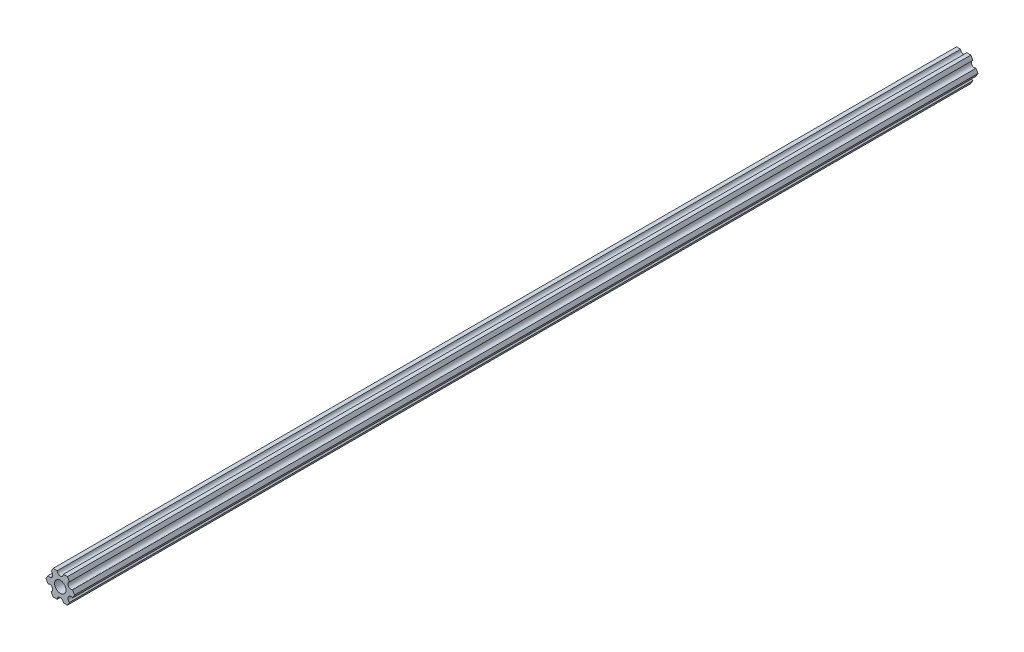
ISO-10303-21;
HEADER;
FILE_DESCRIPTION(('STEP AP214'),'2;1');
FILE_NAME('part.step','',(''),(''),'','','');
FILE_SCHEMA(('AUTOMOTIVE_DESIGN { 1 0 10303 214 1 1 1 1 }'));
ENDSEC;
DATA;
#1=APPLICATION_CONTEXT('core data for automotive mechanical design processes');
#2=APPLICATION_PROTOCOL_DEFINITION('international standard','automotive_design',2000,#1);
#3=PRODUCT_CONTEXT('',#1,'mechanical');
#4=PRODUCT('Part','Part','',(#3));
#5=PRODUCT_RELATED_PRODUCT_CATEGORY('part','',(#4));
#6=PRODUCT_DEFINITION_FORMATION('','',#4);
#7=PRODUCT_DEFINITION_CONTEXT('part definition',#1,'design');
#8=PRODUCT_DEFINITION('design','',#6,#7);
#9=PRODUCT_DEFINITION_SHAPE('','',#8);
#10=(LENGTH_UNIT() NAMED_UNIT(*) SI_UNIT(.MILLI.,.METRE.));
#11=(NAMED_UNIT(*) PLANE_ANGLE_UNIT() SI_UNIT($,.RADIAN.));
#12=(NAMED_UNIT(*) SI_UNIT($,.STERADIAN.) SOLID_ANGLE_UNIT());
#13=UNCERTAINTY_MEASURE_WITH_UNIT(LENGTH_MEASURE(1.E-05),#10,'distance_accuracy_value','');
#14=(GEOMETRIC_REPRESENTATION_CONTEXT(3) GLOBAL_UNCERTAINTY_ASSIGNED_CONTEXT((#13)) GLOBAL_UNIT_ASSIGNED_CONTEXT((#10,
#11,#12)) REPRESENTATION_CONTEXT('',''));
#15=CARTESIAN_POINT('',(0.,0.,0.));
#16=DIRECTION('',(0.,0.,1.));
#17=DIRECTION('',(1.,0.,0.));
#18=AXIS2_PLACEMENT_3D('',#15,#16,#17);
#19=CARTESIAN_POINT('',(-5.49926150638083,-3.17499966684068,-463.55));
#20=DIRECTION('',(0.,0.,1.));
#21=DIRECTION('',(1.,0.,0.));
#22=AXIS2_PLACEMENT_3D('',#19,#20,#21);
#23=CYLINDRICAL_SURFACE('',#22,1.58750000000001);
#24=CARTESIAN_POINT('',(-5.49926150638083,-3.17499966684068,0.));
#25=DIRECTION('',(0.,0.,-1.));
#26=DIRECTION('',(-1.,0.,0.));
#27=AXIS2_PLACEMENT_3D('',#24,#25,#26);
#28=CIRCLE('',#27,1.58750000000001);
#29=CARTESIAN_POINT('',(-6.29301142309098,-1.80018429024546,0.));
#30=VERTEX_POINT('',#29);
#31=CARTESIAN_POINT('',(-4.70551158967068,-4.54981504343589,0.));
#32=VERTEX_POINT('',#31);
#33=EDGE_CURVE('E189',#30,#32,#28,.T.);
#34=ORIENTED_EDGE('',*,*,#33,.F.);
#35=DIRECTION('',(0.,0.,1.));
#36=VECTOR('',#35,1.);
#37=CARTESIAN_POINT('',(-6.29301142309098,-1.80018429024546,-463.55));
#38=LINE('',#37,#36);
#39=CARTESIAN_POINT('',(-6.29301142309098,-1.80018429024546,-463.55));
#40=VERTEX_POINT('',#39);
#41=EDGE_CURVE('E11',#40,#30,#38,.T.);
#42=ORIENTED_EDGE('',*,*,#41,.F.);
#43=CARTESIAN_POINT('',(-5.49926150638083,-3.17499966684068,-463.55));
#44=DIRECTION('',(0.,0.,-1.));
#45=DIRECTION('',(-1.,0.,0.));
#46=AXIS2_PLACEMENT_3D('',#43,#44,#45);
#47=CIRCLE('',#46,1.58750000000001);
#48=CARTESIAN_POINT('',(-4.70551158967068,-4.54981504343589,-463.55));
#49=VERTEX_POINT('',#48);
#50=EDGE_CURVE('E240',#40,#49,#47,.T.);
#51=ORIENTED_EDGE('',*,*,#50,.T.);
#52=DIRECTION('',(0.,0.,1.));
#53=VECTOR('',#52,1.);
#54=CARTESIAN_POINT('',(-4.70551158967068,-4.54981504343589,-463.55));
#55=LINE('',#54,#53);
#56=EDGE_CURVE('E35',#49,#32,#55,.T.);
#57=ORIENTED_EDGE('',*,*,#56,.T.);
#58=EDGE_LOOP('',(#34,#42,#51,#57));
#59=FACE_BOUND('',#58,.T.);
#60=ADVANCED_FACE('F32',(#59),#23,.F.);
#61=CARTESIAN_POINT('',(-7.33234841870826,4.44212518856872E-07,-463.55));
#62=DIRECTION('',(-0.866025434075723,-0.499999947533953,0.));
#63=DIRECTION('',(0.499999947533953,-0.866025434075723,0.));
#64=AXIS2_PLACEMENT_3D('',#61,#62,#63);
#65=PLANE('',#64);
#66=DIRECTION('',(0.499999947533953,-0.866025434075723,0.));
#67=VECTOR('',#66,1.);
#68=CARTESIAN_POINT('',(-7.33234841870826,4.44212518856872E-07,0.));
#69=LINE('',#68,#67);
#70=CARTESIAN_POINT('',(-7.33234841870826,4.44212518856872E-07,0.));
#71=VERTEX_POINT('',#70);
#72=EDGE_CURVE('E238',#71,#30,#69,.T.);
#73=ORIENTED_EDGE('',*,*,#72,.F.);
#74=DIRECTION('',(0.,0.,1.));
#75=VECTOR('',#74,1.);
#76=CARTESIAN_POINT('',(-7.33234841870826,4.44212518856872E-07,-463.55));
#77=LINE('',#76,#75);
#78=CARTESIAN_POINT('',(-7.33234841870826,4.44212518856872E-07,-463.55));
#79=VERTEX_POINT('',#78);
#80=EDGE_CURVE('E41',#79,#71,#77,.T.);
#81=ORIENTED_EDGE('',*,*,#80,.F.);
#82=DIRECTION('',(0.499999947533953,-0.866025434075723,0.));
#83=VECTOR('',#82,1.);
#84=CARTESIAN_POINT('',(-7.33234841870826,4.44212518856872E-07,-463.55));
#85=LINE('',#84,#83);
#86=EDGE_CURVE('E179',#79,#40,#85,.T.);
#87=ORIENTED_EDGE('',*,*,#86,.T.);
#88=ORIENTED_EDGE('',*,*,#41,.T.);
#89=EDGE_LOOP('',(#73,#81,#87,#88));
#90=FACE_BOUND('',#89,.T.);
#91=ADVANCED_FACE('F272',(#90),#65,.T.);
#92=CARTESIAN_POINT('',(-6.29301120497139,1.80018505273895,-463.55));
#93=DIRECTION('',(-0.866025373493145,0.500000052466056,0.));
#94=DIRECTION('',(-0.500000052466056,-0.866025373493145,0.));
#95=AXIS2_PLACEMENT_3D('',#92,#93,#94);
#96=PLANE('',#95);
#97=DIRECTION('',(-0.500000052466056,-0.866025373493145,0.));
#98=VECTOR('',#97,1.);
#99=CARTESIAN_POINT('',(-6.29301120497139,1.80018505273895,0.));
#100=LINE('',#99,#98);
#101=CARTESIAN_POINT('',(-6.29301120497139,1.80018505273895,0.));
#102=VERTEX_POINT('',#101);
#103=EDGE_CURVE('E166',#102,#71,#100,.T.);
#104=ORIENTED_EDGE('',*,*,#103,.F.);
#105=DIRECTION('',(0.,0.,1.));
#106=VECTOR('',#105,1.);
#107=CARTESIAN_POINT('',(-6.29301120497139,1.80018505273895,-463.55));
#108=LINE('',#107,#106);
#109=CARTESIAN_POINT('',(-6.29301120497139,1.80018505273895,-463.55));
#110=VERTEX_POINT('',#109);
#111=EDGE_CURVE('E161',#110,#102,#108,.T.);
#112=ORIENTED_EDGE('',*,*,#111,.F.);
#113=DIRECTION('',(-0.500000052466056,-0.866025373493145,0.));
#114=VECTOR('',#113,1.);
#115=CARTESIAN_POINT('',(-6.29301120497139,1.80018505273895,-463.55));
#116=LINE('',#115,#114);
#117=EDGE_CURVE('E164',#110,#79,#116,.T.);
#118=ORIENTED_EDGE('',*,*,#117,.T.);
#119=ORIENTED_EDGE('',*,*,#80,.T.);
#120=EDGE_LOOP('',(#104,#112,#118,#119));
#121=FACE_BOUND('',#120,.T.);
#122=ADVANCED_FACE('F163',(#121),#96,.T.);
#123=CARTESIAN_POINT('',(-5.49926112168152,3.17500033315931,-463.55));
#124=DIRECTION('',(0.,0.,1.));
#125=DIRECTION('',(1.,0.,0.));
#126=AXIS2_PLACEMENT_3D('',#123,#124,#125);
#127=CYLINDRICAL_SURFACE('',#126,1.5875);
#128=CARTESIAN_POINT('',(-5.49926112168152,3.17500033315931,0.));
#129=DIRECTION('',(0.,0.,-1.));
#130=DIRECTION('',(-1.,0.,0.));
#131=AXIS2_PLACEMENT_3D('',#128,#129,#130);
#132=CIRCLE('',#131,1.5875);
#133=CARTESIAN_POINT('',(-4.70551103839166,4.54981561357968,0.));
#134=VERTEX_POINT('',#133);
#135=EDGE_CURVE('E235',#134,#102,#132,.T.);
#136=ORIENTED_EDGE('',*,*,#135,.F.);
#137=DIRECTION('',(0.,0.,1.));
#138=VECTOR('',#137,1.);
#139=CARTESIAN_POINT('',(-4.70551103839166,4.54981561357968,-463.55));
#140=LINE('',#139,#138);
#141=CARTESIAN_POINT('',(-4.70551103839166,4.54981561357968,-463.55));
#142=VERTEX_POINT('',#141);
#143=EDGE_CURVE('E171',#142,#134,#140,.T.);
#144=ORIENTED_EDGE('',*,*,#143,.F.);
#145=CARTESIAN_POINT('',(-5.49926112168152,3.17500033315931,-463.55));
#146=DIRECTION('',(0.,0.,-1.));
#147=DIRECTION('',(-1.,0.,0.));
#148=AXIS2_PLACEMENT_3D('',#145,#146,#147);
#149=CIRCLE('',#148,1.5875);
#150=EDGE_CURVE('E177',#142,#110,#149,.T.);
#151=ORIENTED_EDGE('',*,*,#150,.T.);
#152=ORIENTED_EDGE('',*,*,#111,.T.);
#153=EDGE_LOOP('',(#136,#144,#151,#152));
#154=FACE_BOUND('',#153,.T.);
#155=ADVANCED_FACE('F181',(#154),#127,.F.);
#156=CARTESIAN_POINT('',(-3.66617382465472,6.35000022210622,-463.55));
#157=DIRECTION('',(-0.866025373493145,0.500000052466056,0.));
#158=DIRECTION('',(-0.500000052466056,-0.866025373493145,0.));
#159=AXIS2_PLACEMENT_3D('',#156,#157,#158);
#160=PLANE('',#159);
#161=DIRECTION('',(-0.500000052466056,-0.866025373493145,0.));
#162=VECTOR('',#161,1.);
#163=CARTESIAN_POINT('',(-3.66617382465472,6.35000022210622,0.));
#164=LINE('',#163,#162);
#165=CARTESIAN_POINT('',(-3.66617382465472,6.35000022210622,0.));
#166=VERTEX_POINT('',#165);
#167=EDGE_CURVE('E232',#166,#134,#164,.T.);
#168=ORIENTED_EDGE('',*,*,#167,.F.);
#169=DIRECTION('',(0.,0.,1.));
#170=VECTOR('',#169,1.);
#171=CARTESIAN_POINT('',(-3.66617382465472,6.35000022210622,-463.55));
#172=LINE('',#171,#170);
#173=CARTESIAN_POINT('',(-3.66617382465472,6.35000022210622,-463.55));
#174=VERTEX_POINT('',#173);
#175=EDGE_CURVE('E244',#174,#166,#172,.T.);
#176=ORIENTED_EDGE('',*,*,#175,.F.);
#177=DIRECTION('',(-0.500000052466056,-0.866025373493145,0.));
#178=VECTOR('',#177,1.);
#179=CARTESIAN_POINT('',(-3.66617382465472,6.35000022210622,-463.55));
#180=LINE('',#179,#178);
#181=EDGE_CURVE('E182',#174,#142,#180,.T.);
#182=ORIENTED_EDGE('',*,*,#181,.T.);
#183=ORIENTED_EDGE('',*,*,#143,.T.);
#184=EDGE_LOOP('',(#168,#176,#182,#183));
#185=FACE_BOUND('',#184,.T.);
#186=ADVANCED_FACE('F285',(#185),#160,.T.);
#187=CARTESIAN_POINT('',(-1.58749884590197,6.35000022210623,-463.55));
#188=DIRECTION('',(0.,1.,0.));
#189=DIRECTION('',(-1.,0.,0.));
#190=AXIS2_PLACEMENT_3D('',#187,#188,#189);
#191=PLANE('',#190);
#192=DIRECTION('',(-1.,0.,0.));
#193=VECTOR('',#192,1.);
#194=CARTESIAN_POINT('',(-1.58749884590197,6.35000022210623,0.));
#195=LINE('',#194,#193);
#196=CARTESIAN_POINT('',(-1.58749884590197,6.35000022210623,0.));
#197=VERTEX_POINT('',#196);
#198=EDGE_CURVE('E229',#197,#166,#195,.T.);
#199=ORIENTED_EDGE('',*,*,#198,.F.);
#200=DIRECTION('',(0.,0.,1.));
#201=VECTOR('',#200,1.);
#202=CARTESIAN_POINT('',(-1.58749884590197,6.35000022210623,-463.55));
#203=LINE('',#202,#201);
#204=CARTESIAN_POINT('',(-1.58749884590197,6.35000022210623,-463.55));
#205=VERTEX_POINT('',#204);
#206=EDGE_CURVE('E246',#205,#197,#203,.T.);
#207=ORIENTED_EDGE('',*,*,#206,.F.);
#208=DIRECTION('',(-1.,0.,0.));
#209=VECTOR('',#208,1.);
#210=CARTESIAN_POINT('',(-1.58749884590197,6.35000022210623,-463.55));
#211=LINE('',#210,#209);
#212=EDGE_CURVE('E184',#205,#174,#211,.T.);
#213=ORIENTED_EDGE('',*,*,#212,.T.);
#214=ORIENTED_EDGE('',*,*,#175,.T.);
#215=EDGE_LOOP('',(#199,#207,#213,#214));
#216=FACE_BOUND('',#215,.T.);
#217=ADVANCED_FACE('F288',(#216),#191,.T.);
#218=CARTESIAN_POINT('',(3.84699344941095E-07,6.35000022210623,-463.55));
#219=DIRECTION('',(0.,0.,1.));
#220=DIRECTION('',(1.,0.,0.));
#221=AXIS2_PLACEMENT_3D('',#218,#219,#220);
#222=CYLINDRICAL_SURFACE('',#221,1.58749884590197);
#223=CARTESIAN_POINT('',(3.84699344941095E-07,6.35000022210623,0.));
#224=DIRECTION('',(0.,0.,-1.));
#225=DIRECTION('',(-1.,0.,0.));
#226=AXIS2_PLACEMENT_3D('',#223,#224,#225);
#227=CIRCLE('',#226,1.58749884590197);
#228=CARTESIAN_POINT('',(1.58749923060131,6.35000022210623,0.));
#229=VERTEX_POINT('',#228);
#230=EDGE_CURVE('E226',#229,#197,#227,.T.);
#231=ORIENTED_EDGE('',*,*,#230,.F.);
#232=DIRECTION('',(0.,0.,1.));
#233=VECTOR('',#232,1.);
#234=CARTESIAN_POINT('',(1.58749923060131,6.35000022210623,-463.55));
#235=LINE('',#234,#233);
#236=CARTESIAN_POINT('',(1.58749923060131,6.35000022210623,-463.55));
#237=VERTEX_POINT('',#236);
#238=EDGE_CURVE('E248',#237,#229,#235,.T.);
#239=ORIENTED_EDGE('',*,*,#238,.F.);
#240=CARTESIAN_POINT('',(3.84699344941095E-07,6.35000022210623,-463.55));
#241=DIRECTION('',(0.,0.,-1.));
#242=DIRECTION('',(-1.,0.,0.));
#243=AXIS2_PLACEMENT_3D('',#240,#241,#242);
#244=CIRCLE('',#243,1.58749884590197);
#245=EDGE_CURVE('E393',#237,#205,#244,.T.);
#246=ORIENTED_EDGE('',*,*,#245,.T.);
#247=ORIENTED_EDGE('',*,*,#206,.T.);
#248=EDGE_LOOP('',(#231,#239,#246,#247));
#249=FACE_BOUND('',#248,.T.);
#250=ADVANCED_FACE('F292',(#249),#222,.F.);
#251=CARTESIAN_POINT('',(3.66617452134701,6.35000022210623,-463.55));
#252=DIRECTION('',(0.,1.,0.));
#253=DIRECTION('',(-1.,0.,0.));
#254=AXIS2_PLACEMENT_3D('',#251,#252,#253);
#255=PLANE('',#254);
#256=DIRECTION('',(-1.,0.,0.));
#257=VECTOR('',#256,1.);
#258=CARTESIAN_POINT('',(3.66617452134701,6.35000022210623,0.));
#259=LINE('',#258,#257);
#260=CARTESIAN_POINT('',(3.66617452134701,6.35000022210623,0.));
#261=VERTEX_POINT('',#260);
#262=EDGE_CURVE('E223',#261,#229,#259,.T.);
#263=ORIENTED_EDGE('',*,*,#262,.F.);
#264=DIRECTION('',(0.,0.,1.));
#265=VECTOR('',#264,1.);
#266=CARTESIAN_POINT('',(3.66617452134701,6.35000022210623,-463.55));
#267=LINE('',#266,#265);
#268=CARTESIAN_POINT('',(3.66617452134701,6.35000022210623,-463.55));
#269=VERTEX_POINT('',#268);
#270=EDGE_CURVE('E250',#269,#261,#267,.T.);
#271=ORIENTED_EDGE('',*,*,#270,.F.);
#272=DIRECTION('',(-1.,0.,0.));
#273=VECTOR('',#272,1.);
#274=CARTESIAN_POINT('',(3.66617452134701,6.35000022210623,-463.55));
#275=LINE('',#274,#273);
#276=EDGE_CURVE('E390',#269,#237,#275,.T.);
#277=ORIENTED_EDGE('',*,*,#276,.T.);
#278=ORIENTED_EDGE('',*,*,#238,.T.);
#279=EDGE_LOOP('',(#263,#271,#277,#278));
#280=FACE_BOUND('',#279,.T.);
#281=ADVANCED_FACE('F296',(#280),#255,.T.);
#282=CARTESIAN_POINT('',(4.70551142760333,4.54981551649452,-463.55));
#283=DIRECTION('',(0.866025449221368,0.499999921300922,0.));
#284=DIRECTION('',(-0.499999921300922,0.866025449221368,0.));
#285=AXIS2_PLACEMENT_3D('',#282,#283,#284);
#286=PLANE('',#285);
#287=DIRECTION('',(-0.499999921300922,0.866025449221368,0.));
#288=VECTOR('',#287,1.);
#289=CARTESIAN_POINT('',(4.70551142760333,4.54981551649452,0.));
#290=LINE('',#289,#288);
#291=CARTESIAN_POINT('',(4.70551142760333,4.54981551649452,0.));
#292=VERTEX_POINT('',#291);
#293=EDGE_CURVE('E220',#292,#261,#290,.T.);
#294=ORIENTED_EDGE('',*,*,#293,.F.);
#295=DIRECTION('',(0.,0.,1.));
#296=VECTOR('',#295,1.);
#297=CARTESIAN_POINT('',(4.70551142760333,4.54981551649452,-463.55));
#298=LINE('',#297,#296);
#299=CARTESIAN_POINT('',(4.70551142760333,4.54981551649452,-463.55));
#300=VERTEX_POINT('',#299);
#301=EDGE_CURVE('E252',#300,#292,#298,.T.);
#302=ORIENTED_EDGE('',*,*,#301,.F.);
#303=DIRECTION('',(-0.499999921300922,0.866025449221368,0.));
#304=VECTOR('',#303,1.);
#305=CARTESIAN_POINT('',(4.70551142760333,4.54981551649452,-463.55));
#306=LINE('',#305,#304);
#307=EDGE_CURVE('E387',#300,#269,#306,.T.);
#308=ORIENTED_EDGE('',*,*,#307,.T.);
#309=ORIENTED_EDGE('',*,*,#270,.T.);
#310=EDGE_LOOP('',(#294,#302,#308,#309));
#311=FACE_BOUND('',#310,.T.);
#312=ADVANCED_FACE('F300',(#311),#286,.T.);
#313=CARTESIAN_POINT('',(5.49926130266854,3.1750001158556,-463.55));
#314=DIRECTION('',(0.,0.,1.));
#315=DIRECTION('',(1.,0.,0.));
#316=AXIS2_PLACEMENT_3D('',#313,#314,#315);
#317=CYLINDRICAL_SURFACE('',#316,1.5875);
#318=CARTESIAN_POINT('',(5.49926130266854,3.1750001158556,0.));
#319=DIRECTION('',(0.,0.,-1.));
#320=DIRECTION('',(-1.,0.,0.));
#321=AXIS2_PLACEMENT_3D('',#318,#319,#320);
#322=CIRCLE('',#321,1.5875);
#323=CARTESIAN_POINT('',(6.29301117773375,1.80018471521667,0.));
#324=VERTEX_POINT('',#323);
#325=EDGE_CURVE('E217',#324,#292,#322,.T.);
#326=ORIENTED_EDGE('',*,*,#325,.F.);
#327=DIRECTION('',(0.,0.,1.));
#328=VECTOR('',#327,1.);
#329=CARTESIAN_POINT('',(6.29301117773375,1.80018471521667,-463.55));
#330=LINE('',#329,#328);
#331=CARTESIAN_POINT('',(6.29301117773375,1.80018471521667,-463.55));
#332=VERTEX_POINT('',#331);
#333=EDGE_CURVE('E254',#332,#324,#330,.T.);
#334=ORIENTED_EDGE('',*,*,#333,.F.);
#335=CARTESIAN_POINT('',(5.49926130266854,3.1750001158556,-463.55));
#336=DIRECTION('',(0.,0.,-1.));
#337=DIRECTION('',(-1.,0.,0.));
#338=AXIS2_PLACEMENT_3D('',#335,#336,#337);
#339=CIRCLE('',#338,1.5875);
#340=EDGE_CURVE('E384',#332,#300,#339,.T.);
#341=ORIENTED_EDGE('',*,*,#340,.T.);
#342=ORIENTED_EDGE('',*,*,#301,.T.);
#343=EDGE_LOOP('',(#326,#334,#341,#342));
#344=FACE_BOUND('',#343,.T.);
#345=ADVANCED_FACE('F304',(#344),#317,.F.);
#346=CARTESIAN_POINT('',(7.33234803400895,9.61748368946088E-08,-463.55));
#347=DIRECTION('',(0.866025449221368,0.499999921300922,0.));
#348=DIRECTION('',(-0.499999921300922,0.866025449221368,0.));
#349=AXIS2_PLACEMENT_3D('',#346,#347,#348);
#350=PLANE('',#349);
#351=DIRECTION('',(-0.499999921300922,0.866025449221368,0.));
#352=VECTOR('',#351,1.);
#353=CARTESIAN_POINT('',(7.33234803400895,9.61748368946088E-08,0.));
#354=LINE('',#353,#352);
#355=CARTESIAN_POINT('',(7.33234803400895,9.61748368946088E-08,0.));
#356=VERTEX_POINT('',#355);
#357=EDGE_CURVE('E214',#356,#324,#354,.T.);
#358=ORIENTED_EDGE('',*,*,#357,.F.);
#359=DIRECTION('',(0.,0.,1.));
#360=VECTOR('',#359,1.);
#361=CARTESIAN_POINT('',(7.33234803400895,9.61748368946088E-08,-463.55));
#362=LINE('',#361,#360);
#363=CARTESIAN_POINT('',(7.33234803400895,9.61748368946088E-08,-463.55));
#364=VERTEX_POINT('',#363);
#365=EDGE_CURVE('E256',#364,#356,#362,.T.);
#366=ORIENTED_EDGE('',*,*,#365,.F.);
#367=DIRECTION('',(-0.499999921300922,0.866025449221368,0.));
#368=VECTOR('',#367,1.);
#369=CARTESIAN_POINT('',(7.33234803400895,9.61748368946088E-08,-463.55));
#370=LINE('',#369,#368);
#371=EDGE_CURVE('E381',#364,#332,#370,.T.);
#372=ORIENTED_EDGE('',*,*,#371,.T.);
#373=ORIENTED_EDGE('',*,*,#333,.T.);
#374=EDGE_LOOP('',(#358,#366,#372,#373));
#375=FACE_BOUND('',#374,.T.);
#376=ADVANCED_FACE('F308',(#375),#350,.T.);
#377=CARTESIAN_POINT('',(6.29301092933191,-1.80018457531732,-463.55));
#378=DIRECTION('',(0.866025403784438,-0.5,0.));
#379=DIRECTION('',(0.5,0.866025403784438,0.));
#380=AXIS2_PLACEMENT_3D('',#377,#378,#379);
#381=PLANE('',#380);
#382=DIRECTION('',(0.5,0.866025403784438,0.));
#383=VECTOR('',#382,1.);
#384=CARTESIAN_POINT('',(6.29301092933191,-1.80018457531732,0.));
#385=LINE('',#384,#383);
#386=CARTESIAN_POINT('',(6.29301092933191,-1.80018457531732,0.));
#387=VERTEX_POINT('',#386);
#388=EDGE_CURVE('E211',#387,#356,#385,.T.);
#389=ORIENTED_EDGE('',*,*,#388,.F.);
#390=DIRECTION('',(0.,0.,1.));
#391=VECTOR('',#390,1.);
#392=CARTESIAN_POINT('',(6.29301092933191,-1.80018457531732,-463.55));
#393=LINE('',#392,#391);
#394=CARTESIAN_POINT('',(6.29301092933191,-1.80018457531732,-463.55));
#395=VERTEX_POINT('',#394);
#396=EDGE_CURVE('E258',#395,#387,#393,.T.);
#397=ORIENTED_EDGE('',*,*,#396,.F.);
#398=DIRECTION('',(0.5,0.866025403784438,0.));
#399=VECTOR('',#398,1.);
#400=CARTESIAN_POINT('',(6.29301092933191,-1.80018457531732,-463.55));
#401=LINE('',#400,#399);
#402=EDGE_CURVE('E378',#395,#364,#401,.T.);
#403=ORIENTED_EDGE('',*,*,#402,.T.);
#404=ORIENTED_EDGE('',*,*,#365,.T.);
#405=EDGE_LOOP('',(#389,#397,#403,#404));
#406=FACE_BOUND('',#405,.T.);
#407=ADVANCED_FACE('F312',(#406),#381,.T.);
#408=CARTESIAN_POINT('',(5.49926092933191,-3.17499990382512,-463.55));
#409=DIRECTION('',(0.,0.,1.));
#410=DIRECTION('',(1.,0.,0.));
#411=AXIS2_PLACEMENT_3D('',#408,#409,#410);
#412=CYLINDRICAL_SURFACE('',#411,1.5875);
#413=CARTESIAN_POINT('',(5.49926092933191,-3.17499990382512,0.));
#414=DIRECTION('',(0.,0.,-1.));
#415=DIRECTION('',(-1.,0.,0.));
#416=AXIS2_PLACEMENT_3D('',#413,#414,#415);
#417=CIRCLE('',#416,1.5875);
#418=CARTESIAN_POINT('',(4.70551092933191,-4.54981523233291,0.));
#419=VERTEX_POINT('',#418);
#420=EDGE_CURVE('E208',#419,#387,#417,.T.);
#421=ORIENTED_EDGE('',*,*,#420,.F.);
#422=DIRECTION('',(0.,0.,1.));
#423=VECTOR('',#422,1.);
#424=CARTESIAN_POINT('',(4.70551092933191,-4.54981523233291,-463.55));
#425=LINE('',#424,#423);
#426=CARTESIAN_POINT('',(4.70551092933191,-4.54981523233291,-463.55));
#427=VERTEX_POINT('',#426);
#428=EDGE_CURVE('E260',#427,#419,#425,.T.);
#429=ORIENTED_EDGE('',*,*,#428,.F.);
#430=CARTESIAN_POINT('',(5.49926092933191,-3.17499990382512,-463.55));
#431=DIRECTION('',(0.,0.,-1.));
#432=DIRECTION('',(-1.,0.,0.));
#433=AXIS2_PLACEMENT_3D('',#430,#431,#432);
#434=CIRCLE('',#433,1.5875);
#435=EDGE_CURVE('E375',#427,#395,#434,.T.);
#436=ORIENTED_EDGE('',*,*,#435,.T.);
#437=ORIENTED_EDGE('',*,*,#396,.T.);
#438=EDGE_LOOP('',(#421,#429,#436,#437));
#439=FACE_BOUND('',#438,.T.);
#440=ADVANCED_FACE('F316',(#439),#412,.F.);
#441=CARTESIAN_POINT('',(3.66617382465481,-6.34999990382519,-463.55));
#442=DIRECTION('',(0.866025403784439,-0.5,0.));
#443=DIRECTION('',(0.5,0.866025403784439,0.));
#444=AXIS2_PLACEMENT_3D('',#441,#442,#443);
#445=PLANE('',#444);
#446=DIRECTION('',(0.5,0.866025403784439,0.));
#447=VECTOR('',#446,1.);
#448=CARTESIAN_POINT('',(3.66617382465481,-6.34999990382519,0.));
#449=LINE('',#448,#447);
#450=CARTESIAN_POINT('',(3.66617382465481,-6.34999990382519,0.));
#451=VERTEX_POINT('',#450);
#452=EDGE_CURVE('E205',#451,#419,#449,.T.);
#453=ORIENTED_EDGE('',*,*,#452,.F.);
#454=DIRECTION('',(0.,0.,1.));
#455=VECTOR('',#454,1.);
#456=CARTESIAN_POINT('',(3.66617382465481,-6.34999990382519,-463.55));
#457=LINE('',#456,#455);
#458=CARTESIAN_POINT('',(3.66617382465481,-6.34999990382519,-463.55));
#459=VERTEX_POINT('',#458);
#460=EDGE_CURVE('E262',#459,#451,#457,.T.);
#461=ORIENTED_EDGE('',*,*,#460,.F.);
#462=DIRECTION('',(0.5,0.866025403784439,0.));
#463=VECTOR('',#462,1.);
#464=CARTESIAN_POINT('',(3.66617382465481,-6.34999990382519,-463.55));
#465=LINE('',#464,#463);
#466=EDGE_CURVE('E372',#459,#427,#465,.T.);
#467=ORIENTED_EDGE('',*,*,#466,.T.);
#468=ORIENTED_EDGE('',*,*,#428,.T.);
#469=EDGE_LOOP('',(#453,#461,#467,#468));
#470=FACE_BOUND('',#469,.T.);
#471=ADVANCED_FACE('F320',(#470),#445,.T.);
#472=CARTESIAN_POINT('',(1.58750115409778,-6.34999990382519,-463.55));
#473=DIRECTION('',(0.,-1.,0.));
#474=DIRECTION('',(1.,0.,0.));
#475=AXIS2_PLACEMENT_3D('',#472,#473,#474);
#476=PLANE('',#475);
#477=DIRECTION('',(1.,0.,0.));
#478=VECTOR('',#477,1.);
#479=CARTESIAN_POINT('',(1.58750115409778,-6.34999990382519,0.));
#480=LINE('',#479,#478);
#481=CARTESIAN_POINT('',(1.58750115409778,-6.34999990382519,0.));
#482=VERTEX_POINT('',#481);
#483=EDGE_CURVE('E202',#482,#451,#480,.T.);
#484=ORIENTED_EDGE('',*,*,#483,.F.);
#485=DIRECTION('',(0.,0.,1.));
#486=VECTOR('',#485,1.);
#487=CARTESIAN_POINT('',(1.58750115409778,-6.34999990382519,-463.55));
#488=LINE('',#487,#486);
#489=CARTESIAN_POINT('',(1.58750115409778,-6.34999990382519,-463.55));
#490=VERTEX_POINT('',#489);
#491=EDGE_CURVE('E264',#490,#482,#488,.T.);
#492=ORIENTED_EDGE('',*,*,#491,.F.);
#493=DIRECTION('',(1.,0.,0.));
#494=VECTOR('',#493,1.);
#495=CARTESIAN_POINT('',(1.58750115409778,-6.34999990382519,-463.55));
#496=LINE('',#495,#494);
#497=EDGE_CURVE('E369',#490,#459,#496,.T.);
#498=ORIENTED_EDGE('',*,*,#497,.T.);
#499=ORIENTED_EDGE('',*,*,#460,.T.);
#500=EDGE_LOOP('',(#484,#492,#498,#499));
#501=FACE_BOUND('',#500,.T.);
#502=ADVANCED_FACE('F324',(#501),#476,.T.);
#503=CARTESIAN_POINT('',(-3.8469926204343E-07,-6.34999990382519,-463.55));
#504=DIRECTION('',(0.,0.,1.));
#505=DIRECTION('',(1.,0.,0.));
#506=AXIS2_PLACEMENT_3D('',#503,#504,#505);
#507=CYLINDRICAL_SURFACE('',#506,1.58750115409778);
#508=CARTESIAN_POINT('',(-3.8469926204343E-07,-6.34999990382519,0.));
#509=DIRECTION('',(0.,0.,-1.));
#510=DIRECTION('',(-1.,0.,0.));
#511=AXIS2_PLACEMENT_3D('',#508,#509,#510);
#512=CIRCLE('',#511,1.58750115409778);
#513=CARTESIAN_POINT('',(-1.58750153879705,-6.34999990382519,0.));
#514=VERTEX_POINT('',#513);
#515=EDGE_CURVE('E199',#514,#482,#512,.T.);
#516=ORIENTED_EDGE('',*,*,#515,.F.);
#517=DIRECTION('',(0.,0.,1.));
#518=VECTOR('',#517,1.);
#519=CARTESIAN_POINT('',(-1.58750153879705,-6.34999990382519,-463.55));
#520=LINE('',#519,#518);
#521=CARTESIAN_POINT('',(-1.58750153879705,-6.34999990382519,-463.55));
#522=VERTEX_POINT('',#521);
#523=EDGE_CURVE('E266',#522,#514,#520,.T.);
#524=ORIENTED_EDGE('',*,*,#523,.F.);
#525=CARTESIAN_POINT('',(-3.8469926204343E-07,-6.34999990382519,-463.55));
#526=DIRECTION('',(0.,0.,-1.));
#527=DIRECTION('',(-1.,0.,0.));
#528=AXIS2_PLACEMENT_3D('',#525,#526,#527);
#529=CIRCLE('',#528,1.58750115409778);
#530=EDGE_CURVE('E366',#522,#490,#529,.T.);
#531=ORIENTED_EDGE('',*,*,#530,.T.);
#532=ORIENTED_EDGE('',*,*,#491,.T.);
#533=EDGE_LOOP('',(#516,#524,#531,#532));
#534=FACE_BOUND('',#533,.T.);
#535=ADVANCED_FACE('F328',(#534),#507,.F.);
#536=CARTESIAN_POINT('',(-3.66617452134693,-6.34999990382519,-463.55));
#537=DIRECTION('',(0.,-1.,0.));
#538=DIRECTION('',(1.,0.,0.));
#539=AXIS2_PLACEMENT_3D('',#536,#537,#538);
#540=PLANE('',#539);
#541=DIRECTION('',(1.,0.,0.));
#542=VECTOR('',#541,1.);
#543=CARTESIAN_POINT('',(-3.66617452134693,-6.34999990382519,0.));
#544=LINE('',#543,#542);
#545=CARTESIAN_POINT('',(-3.66617452134693,-6.34999990382519,0.));
#546=VERTEX_POINT('',#545);
#547=EDGE_CURVE('E196',#546,#514,#544,.T.);
#548=ORIENTED_EDGE('',*,*,#547,.F.);
#549=DIRECTION('',(0.,0.,1.));
#550=VECTOR('',#549,1.);
#551=CARTESIAN_POINT('',(-3.66617452134693,-6.34999990382519,-463.55));
#552=LINE('',#551,#550);
#553=CARTESIAN_POINT('',(-3.66617452134693,-6.34999990382519,-463.55));
#554=VERTEX_POINT('',#553);
#555=EDGE_CURVE('E267',#554,#546,#552,.T.);
#556=ORIENTED_EDGE('',*,*,#555,.F.);
#557=DIRECTION('',(1.,0.,0.));
#558=VECTOR('',#557,1.);
#559=CARTESIAN_POINT('',(-3.66617452134693,-6.34999990382519,-463.55));
#560=LINE('',#559,#558);
#561=EDGE_CURVE('E363',#554,#522,#560,.T.);
#562=ORIENTED_EDGE('',*,*,#561,.T.);
#563=ORIENTED_EDGE('',*,*,#523,.T.);
#564=EDGE_LOOP('',(#548,#556,#562,#563));
#565=FACE_BOUND('',#564,.T.);
#566=ADVANCED_FACE('F332',(#565),#540,.T.);
#567=CARTESIAN_POINT('',(-4.70551158967068,-4.54981504343589,-463.55));
#568=DIRECTION('',(-0.866025434075723,-0.499999947533953,0.));
#569=DIRECTION('',(0.499999947533953,-0.866025434075723,0.));
#570=AXIS2_PLACEMENT_3D('',#567,#568,#569);
#571=PLANE('',#570);
#572=DIRECTION('',(0.499999947533953,-0.866025434075723,0.));
#573=VECTOR('',#572,1.);
#574=CARTESIAN_POINT('',(-4.70551158967068,-4.54981504343589,0.));
#575=LINE('',#574,#573);
#576=EDGE_CURVE('E192',#32,#546,#575,.T.);
#577=ORIENTED_EDGE('',*,*,#576,.F.);
#578=ORIENTED_EDGE('',*,*,#56,.F.);
#579=DIRECTION('',(0.499999947533953,-0.866025434075723,0.));
#580=VECTOR('',#579,1.);
#581=CARTESIAN_POINT('',(-4.70551158967068,-4.54981504343589,-463.55));
#582=LINE('',#581,#580);
#583=EDGE_CURVE('E361',#49,#554,#582,.T.);
#584=ORIENTED_EDGE('',*,*,#583,.T.);
#585=ORIENTED_EDGE('',*,*,#555,.T.);
#586=EDGE_LOOP('',(#577,#578,#584,#585));
#587=FACE_BOUND('',#586,.T.);
#588=ADVANCED_FACE('F269',(#587),#571,.T.);
#589=CARTESIAN_POINT('',(-5.49926150638083,-3.17499966684068,-463.55));
#590=DIRECTION('',(0.,0.,-1.));
#591=DIRECTION('',(-1.,0.,0.));
#592=AXIS2_PLACEMENT_3D('',#589,#590,#591);
#593=PLANE('',#592);
#594=CARTESIAN_POINT('',(0.,0.,-463.55));
#595=DIRECTION('',(0.,0.,1.));
#596=DIRECTION('',(-1.,0.,0.));
#597=AXIS2_PLACEMENT_3D('',#594,#595,#596);
#598=CIRCLE('',#597,2.9337);
#599=CARTESIAN_POINT('',(-2.9337,0.,-463.55));
#600=VERTEX_POINT('',#599);
#601=EDGE_CURVE('E193',#600,#600,#598,.T.);
#602=ORIENTED_EDGE('',*,*,#601,.T.);
#603=EDGE_LOOP('',(#602));
#604=FACE_BOUND('',#603,.T.);
#605=ORIENTED_EDGE('',*,*,#50,.F.);
#606=ORIENTED_EDGE('',*,*,#86,.F.);
#607=ORIENTED_EDGE('',*,*,#117,.F.);
#608=ORIENTED_EDGE('',*,*,#150,.F.);
#609=ORIENTED_EDGE('',*,*,#181,.F.);
#610=ORIENTED_EDGE('',*,*,#212,.F.);
#611=ORIENTED_EDGE('',*,*,#245,.F.);
#612=ORIENTED_EDGE('',*,*,#276,.F.);
#613=ORIENTED_EDGE('',*,*,#307,.F.);
#614=ORIENTED_EDGE('',*,*,#340,.F.);
#615=ORIENTED_EDGE('',*,*,#371,.F.);
#616=ORIENTED_EDGE('',*,*,#402,.F.);
#617=ORIENTED_EDGE('',*,*,#435,.F.);
#618=ORIENTED_EDGE('',*,*,#466,.F.);
#619=ORIENTED_EDGE('',*,*,#497,.F.);
#620=ORIENTED_EDGE('',*,*,#530,.F.);
#621=ORIENTED_EDGE('',*,*,#561,.F.);
#622=ORIENTED_EDGE('',*,*,#583,.F.);
#623=EDGE_LOOP('',(#605,#606,#607,#608,#609,#610,#611,#612,#613,#614,#615,#616,#617,#618,#619,
#620,#621,#622));
#624=FACE_BOUND('',#623,.T.);
#625=ADVANCED_FACE('F175',(#604,#624),#593,.T.);
#626=CARTESIAN_POINT('',(-5.49926150638083,-3.17499966684068,0.));
#627=DIRECTION('',(0.,0.,-1.));
#628=DIRECTION('',(-1.,0.,0.));
#629=AXIS2_PLACEMENT_3D('',#626,#627,#628);
#630=PLANE('',#629);
#631=CARTESIAN_POINT('',(0.,0.,0.));
#632=DIRECTION('',(0.,0.,1.));
#633=DIRECTION('',(-1.,0.,0.));
#634=AXIS2_PLACEMENT_3D('',#631,#632,#633);
#635=CIRCLE('',#634,2.9337);
#636=CARTESIAN_POINT('',(-2.9337,0.,0.));
#637=VERTEX_POINT('',#636);
#638=EDGE_CURVE('E356',#637,#637,#635,.T.);
#639=ORIENTED_EDGE('',*,*,#638,.F.);
#640=EDGE_LOOP('',(#639));
#641=FACE_BOUND('',#640,.T.);
#642=ORIENTED_EDGE('',*,*,#33,.T.);
#643=ORIENTED_EDGE('',*,*,#576,.T.);
#644=ORIENTED_EDGE('',*,*,#547,.T.);
#645=ORIENTED_EDGE('',*,*,#515,.T.);
#646=ORIENTED_EDGE('',*,*,#483,.T.);
#647=ORIENTED_EDGE('',*,*,#452,.T.);
#648=ORIENTED_EDGE('',*,*,#420,.T.);
#649=ORIENTED_EDGE('',*,*,#388,.T.);
#650=ORIENTED_EDGE('',*,*,#357,.T.);
#651=ORIENTED_EDGE('',*,*,#325,.T.);
#652=ORIENTED_EDGE('',*,*,#293,.T.);
#653=ORIENTED_EDGE('',*,*,#262,.T.);
#654=ORIENTED_EDGE('',*,*,#230,.T.);
#655=ORIENTED_EDGE('',*,*,#198,.T.);
#656=ORIENTED_EDGE('',*,*,#167,.T.);
#657=ORIENTED_EDGE('',*,*,#135,.T.);
#658=ORIENTED_EDGE('',*,*,#103,.T.);
#659=ORIENTED_EDGE('',*,*,#72,.T.);
#660=EDGE_LOOP('',(#642,#643,#644,#645,#646,#647,#648,#649,#650,#651,#652,#653,#654,#655,#656,
#657,#658,#659));
#661=FACE_BOUND('',#660,.T.);
#662=ADVANCED_FACE('F271',(#641,#661),#630,.F.);
#663=CARTESIAN_POINT('',(0.,0.,-463.55));
#664=DIRECTION('',(0.,0.,1.));
#665=DIRECTION('',(1.,0.,0.));
#666=AXIS2_PLACEMENT_3D('',#663,#664,#665);
#667=CYLINDRICAL_SURFACE('',#666,2.9337);
#668=ORIENTED_EDGE('',*,*,#601,.F.);
#669=EDGE_LOOP('',(#668));
#670=FACE_BOUND('',#669,.T.);
#671=ORIENTED_EDGE('',*,*,#638,.T.);
#672=EDGE_LOOP('',(#671));
#673=FACE_BOUND('',#672,.T.);
#674=ADVANCED_FACE('F344',(#670,#673),#667,.F.);
#675=CLOSED_SHELL('',(#60,#91,#122,#155,#186,#217,#250,#281,#312,#345,#376,#407,#440,#471,#502,
#535,#566,#588,#625,#662,#674));
#676=MANIFOLD_SOLID_BREP('B2',#675);
#677=ADVANCED_BREP_SHAPE_REPRESENTATION('',(#18,#676),#14);
#678=SHAPE_DEFINITION_REPRESENTATION(#9,#677);
ENDSEC;
END-ISO-10303-21;
